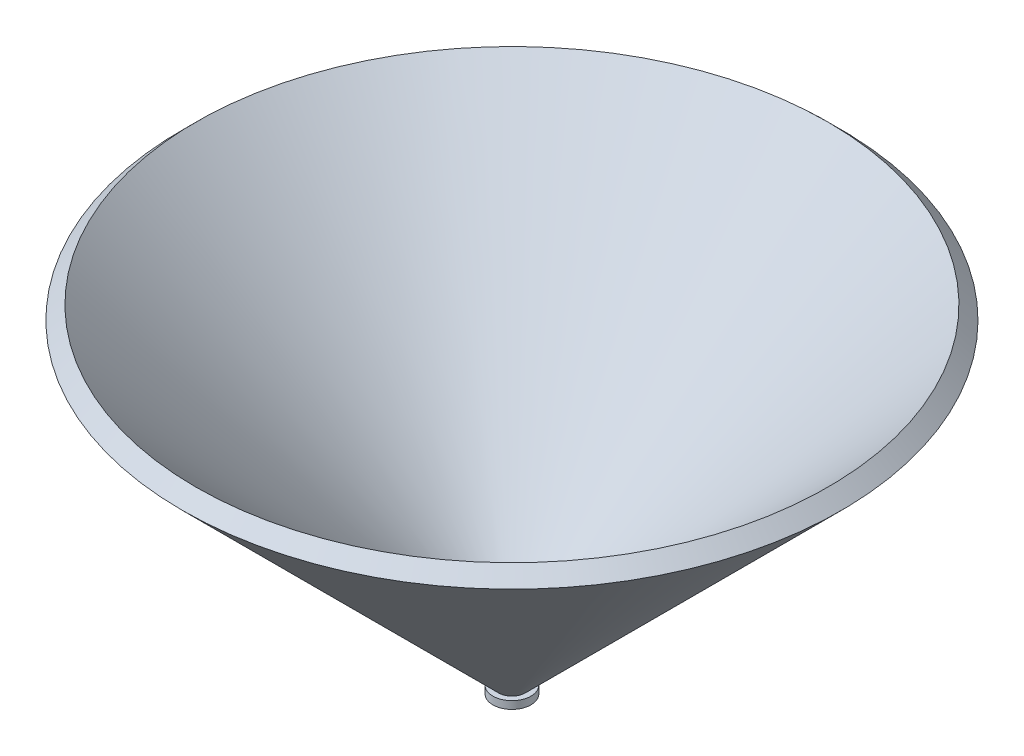
ISO-10303-21;
HEADER;
FILE_DESCRIPTION(('STEP AP214'),'2;1');
FILE_NAME('part.step','',(''),(''),'','','');
FILE_SCHEMA(('AUTOMOTIVE_DESIGN { 1 0 10303 214 1 1 1 1 }'));
ENDSEC;
DATA;
#1=APPLICATION_CONTEXT('core data for automotive mechanical design processes');
#2=APPLICATION_PROTOCOL_DEFINITION('international standard','automotive_design',2000,#1);
#3=PRODUCT_CONTEXT('',#1,'mechanical');
#4=PRODUCT('Part','Part','',(#3));
#5=PRODUCT_RELATED_PRODUCT_CATEGORY('part','',(#4));
#6=PRODUCT_DEFINITION_FORMATION('','',#4);
#7=PRODUCT_DEFINITION_CONTEXT('part definition',#1,'design');
#8=PRODUCT_DEFINITION('design','',#6,#7);
#9=PRODUCT_DEFINITION_SHAPE('','',#8);
#10=(LENGTH_UNIT() NAMED_UNIT(*) SI_UNIT(.MILLI.,.METRE.));
#11=(NAMED_UNIT(*) PLANE_ANGLE_UNIT() SI_UNIT($,.RADIAN.));
#12=(NAMED_UNIT(*) SI_UNIT($,.STERADIAN.) SOLID_ANGLE_UNIT());
#13=UNCERTAINTY_MEASURE_WITH_UNIT(LENGTH_MEASURE(1.E-05),#10,'distance_accuracy_value','');
#14=(GEOMETRIC_REPRESENTATION_CONTEXT(3) GLOBAL_UNCERTAINTY_ASSIGNED_CONTEXT((#13)) GLOBAL_UNIT_ASSIGNED_CONTEXT((#10,
#11,#12)) REPRESENTATION_CONTEXT('',''));
#15=CARTESIAN_POINT('',(0.,0.,0.));
#16=DIRECTION('',(0.,0.,1.));
#17=DIRECTION('',(1.,0.,0.));
#18=AXIS2_PLACEMENT_3D('',#15,#16,#17);
#19=CARTESIAN_POINT('',(3.175,7.03012806053454,0.));
#20=DIRECTION('',(0.,-0.707106781186551,-0.707106781186544));
#21=DIRECTION('',(0.,0.707106781186544,-0.707106781186551));
#22=AXIS2_PLACEMENT_3D('',#19,#20,#21);
#23=PLANE('',#22);
#24=CARTESIAN_POINT('',(3.1752,112.52425081414,-105.494122753607));
#25=CARTESIAN_POINT('',(2.1168,112.540175260111,-105.510047199578));
#26=CARTESIAN_POINT('',(1.0584,112.548137483097,-105.518009422563));
#27=CARTESIAN_POINT('',(-1.0584,112.548137483097,-105.518009422563));
#28=CARTESIAN_POINT('',(-2.1168,112.540175260111,-105.510047199578));
#29=CARTESIAN_POINT('',(-3.1752,112.52425081414,-105.494122753607));
#30=B_SPLINE_CURVE_WITH_KNOTS('',3,(#24,#25,#26,#27,#28,#29),.UNSPECIFIED.,.F.,.F.,(4,2,4),(0.,
3.1753796916129,6.3507593832258),.UNSPECIFIED.);
#31=CARTESIAN_POINT('',(3.175,112.5242538232,-105.494125762667));
#32=VERTEX_POINT('',#31);
#33=CARTESIAN_POINT('',(0.,112.548137483097,-105.518009422563));
#34=VERTEX_POINT('',#33);
#35=EDGE_CURVE('E131',#32,#34,#30,.T.);
#36=ORIENTED_EDGE('',*,*,#35,.F.);
#37=DIRECTION('',(0.,-0.707106781186544,0.707106781186551));
#38=VECTOR('',#37,1.);
#39=CARTESIAN_POINT('',(3.175,7.03012806053454,0.));
#40=LINE('',#39,#38);
#41=CARTESIAN_POINT('',(3.175,112.548137483097,-105.518009422563));
#42=VERTEX_POINT('',#41);
#43=EDGE_CURVE('E175',#42,#32,#40,.T.);
#44=ORIENTED_EDGE('',*,*,#43,.F.);
#45=DIRECTION('',(-1.,0.,0.));
#46=VECTOR('',#45,1.);
#47=CARTESIAN_POINT('',(3.175,112.548137483097,-105.518009422563));
#48=LINE('',#47,#46);
#49=EDGE_CURVE('E158',#42,#34,#48,.T.);
#50=ORIENTED_EDGE('',*,*,#49,.T.);
#51=EDGE_LOOP('',(#36,#44,#50));
#52=FACE_BOUND('',#51,.T.);
#53=ADVANCED_FACE('F34',(#52),#23,.F.);
#54=CARTESIAN_POINT('',(-3.175,112.5242538232,-105.494125762667));
#55=VERTEX_POINT('',#54);
#56=EDGE_CURVE('E54',#34,#55,#30,.T.);
#57=ORIENTED_EDGE('',*,*,#56,.F.);
#58=CARTESIAN_POINT('',(-3.175,112.548137483097,-105.518009422563));
#59=VERTEX_POINT('',#58);
#60=EDGE_CURVE('E161',#34,#59,#48,.T.);
#61=ORIENTED_EDGE('',*,*,#60,.T.);
#62=DIRECTION('',(0.,-0.707106781186544,0.707106781186551));
#63=VECTOR('',#62,1.);
#64=CARTESIAN_POINT('',(-3.175,7.03012806053454,0.));
#65=LINE('',#64,#63);
#66=EDGE_CURVE('E162',#59,#55,#65,.T.);
#67=ORIENTED_EDGE('',*,*,#66,.T.);
#68=EDGE_LOOP('',(#57,#61,#67));
#69=FACE_BOUND('',#68,.T.);
#70=ADVANCED_FACE('F111',(#69),#23,.F.);
#71=CARTESIAN_POINT('',(3.175,0.,0.));
#72=DIRECTION('',(1.,0.,0.));
#73=DIRECTION('',(0.,0.,-1.));
#74=AXIS2_PLACEMENT_3D('',#71,#72,#73);
#75=PLANE('',#74);
#76=CARTESIAN_POINT('',(3.175,200.440526691439,-17.3372968751184));
#77=CARTESIAN_POINT('',(3.175,199.837144502714,-17.950682651951));
#78=CARTESIAN_POINT('',(3.175,199.233266251423,-18.5635798615694));
#79=CARTESIAN_POINT('',(3.175,198.024720068944,-19.7885945605061));
#80=CARTESIAN_POINT('',(3.175,197.420052138242,-20.4007120503028));
#81=CARTESIAN_POINT('',(3.175,196.21012933855,-21.624364426881));
#82=CARTESIAN_POINT('',(3.175,195.604874470568,-22.2358993146598));
#83=CARTESIAN_POINT('',(3.175,194.393900872155,-23.4585098213873));
#84=CARTESIAN_POINT('',(3.175,193.78818214164,-24.0695854402542));
#85=CARTESIAN_POINT('',(3.175,191.970483506003,-25.902268203571));
#86=CARTESIAN_POINT('',(3.175,190.757958133462,-27.1233343102523));
#87=CARTESIAN_POINT('',(3.175,188.331945039224,-29.5645112103778));
#88=CARTESIAN_POINT('',(3.175,187.118457316989,-30.7846220032862));
#89=CARTESIAN_POINT('',(3.175,183.477021622506,-34.4439528778655));
#90=CARTESIAN_POINT('',(3.175,181.048084317772,-36.8821883792525));
#91=CARTESIAN_POINT('',(3.175,176.188803794932,-41.7572580859253));
#92=CARTESIAN_POINT('',(3.175,173.758460576648,-44.1940922910332));
#93=CARTESIAN_POINT('',(3.175,168.896910624069,-49.0668993440678));
#94=CARTESIAN_POINT('',(3.175,166.46570388974,-51.5028721919628));
#95=CARTESIAN_POINT('',(3.175,161.602730189482,-56.374258286182));
#96=CARTESIAN_POINT('',(3.175,159.170963223583,-58.8096715325387));
#97=CARTESIAN_POINT('',(3.175,151.875085175611,-66.1153586832649));
#98=CARTESIAN_POINT('',(3.175,147.010408840598,-70.9850680785807));
#99=CARTESIAN_POINT('',(3.175,137.280275073362,-80.7237055511025));
#100=CARTESIAN_POINT('',(3.175,132.414817641205,-85.5926336283736));
#101=CARTESIAN_POINT('',(3.175,125.629817888244,-92.381809655797));
#102=CARTESIAN_POINT('',(3.175,123.710476484159,-94.3022584000018));
#103=CARTESIAN_POINT('',(3.175,119.871732108325,-98.1430918108623));
#104=CARTESIAN_POINT('',(3.175,117.952329136617,-100.06347647756));
#105=CARTESIAN_POINT('',(3.175,108.99069279537,-109.029457707226));
#106=CARTESIAN_POINT('',(3.175,101.948141007366,-116.074736005152));
#107=CARTESIAN_POINT('',(3.175,87.862649269537,-130.164904596144));
#108=CARTESIAN_POINT('',(3.175,80.8197093197109,-137.209794889208));
#109=CARTESIAN_POINT('',(3.175,66.733564348039,-151.299352916492));
#110=CARTESIAN_POINT('',(3.175,59.6903593254583,-158.344020649977));
#111=CARTESIAN_POINT('',(3.175,45.6037807524923,-172.433187551712));
#112=CARTESIAN_POINT('',(3.175,38.5604072021078,-179.477686719963));
#113=CARTESIAN_POINT('',(3.175,31.5169870136748,-186.522139252704));
#114=B_SPLINE_CURVE_WITH_KNOTS('',3,(#76,#77,#78,#79,#80,#81,#82,#83,#84,#85,#86,#87,#88,#89,
#90,#91,#92,#93,#94,#95,#96,#97,#98,#99,#100,#101,#102,#103,#104,#105,#106,#107,#108,#109,#110,
#111,#112,#113),.UNSPECIFIED.,.F.,.F.,(4,2,2,2,2,2,2,2,2,2,2,2,2,2,2,2,2,2,4),(0.,
2.58124098013675,5.16248037591217,7.74371534458528,10.3249507727548,15.4874087337547,
20.6498695882519,30.9747197477381,41.2995712165369,51.624423064826,61.9492743126231,
82.5990273339478,103.248778631242,111.39420392482,119.539623822162,149.424424905081,
179.309226076388,209.1941173086,239.079008394447),.UNSPECIFIED.);
#115=CARTESIAN_POINT('',(3.175,108.058009422562,-109.962310304486));
#116=VERTEX_POINT('',#115);
#117=EDGE_CURVE('E62',#32,#116,#114,.T.);
#118=ORIENTED_EDGE('',*,*,#117,.T.);
#119=CARTESIAN_POINT('',(3.175,199.518051019844,-201.443159618202));
#120=CARTESIAN_POINT('',(3.175,192.561915516085,-194.486153222348));
#121=CARTESIAN_POINT('',(3.175,185.605818214246,-187.529108627867));
#122=CARTESIAN_POINT('',(3.175,171.693749100649,-173.614893053145));
#123=CARTESIAN_POINT('',(3.175,164.7377772889,-166.657722072896));
#124=CARTESIAN_POINT('',(3.175,150.825998671121,-152.74319416555));
#125=CARTESIAN_POINT('',(3.175,143.870191865357,-145.785837238188));
#126=CARTESIAN_POINT('',(3.175,129.958847254739,-131.870855343057));
#127=CARTESIAN_POINT('',(3.175,123.003309449869,-124.913230375305));
#128=CARTESIAN_POINT('',(3.175,109.097339589966,-111.002230618048));
#129=CARTESIAN_POINT('',(3.175,102.146907246755,-104.048856116628));
#130=CARTESIAN_POINT('',(3.175,91.7218401021594,-93.6182119215384));
#131=CARTESIAN_POINT('',(3.175,88.246914271722,-90.1412331051456));
#132=CARTESIAN_POINT('',(3.175,81.2973402190702,-83.1869981827456));
#133=CARTESIAN_POINT('',(3.175,77.8226919968505,-79.7097420767438));
#134=CARTESIAN_POINT('',(3.175,70.8738022630794,-72.754829961619));
#135=CARTESIAN_POINT('',(3.175,67.3995607511521,-69.2771739528718));
#136=CARTESIAN_POINT('',(3.175,60.451705357375,-62.3212345094503));
#137=CARTESIAN_POINT('',(3.175,56.9780914755723,-58.8429510747291));
#138=CARTESIAN_POINT('',(3.175,50.0318921825025,-51.8853596136983));
#139=CARTESIAN_POINT('',(3.175,46.5593067708796,-48.406051587744));
#140=CARTESIAN_POINT('',(3.175,41.351890458129,-43.1856317373281));
#141=CARTESIAN_POINT('',(3.175,39.6163287600139,-41.4452489243445));
#142=CARTESIAN_POINT('',(3.175,36.1459208087547,-37.9637701653254));
#143=CARTESIAN_POINT('',(3.175,34.4110745555792,-36.2226742193212));
#144=CARTESIAN_POINT('',(3.175,31.7256979913831,-33.5259333310758));
#145=CARTESIAN_POINT('',(3.175,30.7747858741409,-32.5706686033746));
#146=CARTESIAN_POINT('',(3.175,28.8733916546759,-30.6597111151943));
#147=CARTESIAN_POINT('',(3.175,27.9229095524868,-29.7040183546817));
#148=CARTESIAN_POINT('',(3.175,26.0224296574051,-27.7919849779321));
#149=CARTESIAN_POINT('',(3.175,25.0724319141878,-26.8356443123093));
#150=CARTESIAN_POINT('',(3.175,23.173218723277,-24.9221868987253));
#151=CARTESIAN_POINT('',(3.175,22.2240032754545,-23.9650701508922));
#152=CARTESIAN_POINT('',(3.175,20.0059461796568,-21.7260195860442));
#153=CARTESIAN_POINT('',(3.175,18.7375322430043,-20.4436616517314));
#154=CARTESIAN_POINT('',(3.175,16.8375422667745,-18.5177396996414));
#155=CARTESIAN_POINT('',(3.175,16.2047033276086,-17.8754217696252));
#156=CARTESIAN_POINT('',(3.175,14.9401940915483,-16.5896371547109));
#157=CARTESIAN_POINT('',(3.175,14.3085237935301,-15.9461704709185));
#158=CARTESIAN_POINT('',(3.175,13.2556970067994,-14.8709147242164));
#159=CARTESIAN_POINT('',(3.175,12.8340819323047,-14.4395747594874));
#160=CARTESIAN_POINT('',(3.175,11.9918200191652,-13.5759505364723));
#161=CARTESIAN_POINT('',(3.175,11.5711731800159,-13.1436662786786));
#162=CARTESIAN_POINT('',(3.175,10.7309541564058,-12.2776318570922));
#163=CARTESIAN_POINT('',(3.175,10.3113826189845,-11.8438810652788));
#164=CARTESIAN_POINT('',(3.175,9.4740001667022,-10.9746857262887));
#165=CARTESIAN_POINT('',(3.175,9.05618924225662,-10.5392411883575));
#166=CARTESIAN_POINT('',(3.175,8.36073206055526,-9.81024210093843));
#167=CARTESIAN_POINT('',(3.175,8.08239227441539,-9.5173494388155));
#168=CARTESIAN_POINT('',(3.175,7.52718425763152,-8.9301726211461));
#169=CARTESIAN_POINT('',(3.175,7.25031602327546,-8.63588846911325));
#170=CARTESIAN_POINT('',(3.175,6.69894628675608,-8.04592223083668));
#171=CARTESIAN_POINT('',(3.175,6.42444189598318,-7.75024284685787));
#172=CARTESIAN_POINT('',(3.175,5.87811867366579,-7.15642575182525));
#173=CARTESIAN_POINT('',(3.175,5.60629974823107,-6.85828812739072));
#174=CARTESIAN_POINT('',(3.175,5.15581921401611,-6.3577875308385));
#175=CARTESIAN_POINT('',(3.175,4.9760970500796,-6.15638010438162));
#176=CARTESIAN_POINT('',(3.175,4.61890555681003,-5.75157976014491));
#177=CARTESIAN_POINT('',(3.175,4.4414361895919,-5.54818687585636));
#178=CARTESIAN_POINT('',(3.175,4.08866560745706,-5.13784599083981));
#179=CARTESIAN_POINT('',(3.175,3.91337860161195,-4.93088573202484));
#180=CARTESIAN_POINT('',(3.175,3.56703726573556,-4.51354092637145));
#181=CARTESIAN_POINT('',(3.175,3.39598177712001,-4.30315734358356));
#182=CARTESIAN_POINT('',(3.175,3.05822469498269,-3.87562003173794));
#183=CARTESIAN_POINT('',(3.175,2.89157980217528,-3.65842100957378));
#184=CARTESIAN_POINT('',(3.175,2.6484123857098,-3.3273863440383));
#185=CARTESIAN_POINT('',(3.175,2.5684369674218,-3.21609000805243));
#186=CARTESIAN_POINT('',(3.175,2.41140728377533,-2.9914604443459));
#187=CARTESIAN_POINT('',(3.175,2.33435277005435,-2.87812739101933));
#188=CARTESIAN_POINT('',(3.175,2.18442386255193,-2.64976667702616));
#189=CARTESIAN_POINT('',(3.175,2.11152562807547,-2.53475474544742));
#190=CARTESIAN_POINT('',(3.175,1.97039885416144,-2.30184604310898));
#191=CARTESIAN_POINT('',(3.175,1.90217131942869,-2.18394865902323));
#192=CARTESIAN_POINT('',(3.175,1.77196527087485,-1.94508573029549));
#193=CARTESIAN_POINT('',(3.175,1.70997237849318,-1.82412808980253));
#194=CARTESIAN_POINT('',(3.175,1.59395494763549,-1.57848254825579));
#195=CARTESIAN_POINT('',(3.175,1.539925302508,-1.45379710002094));
#196=CARTESIAN_POINT('',(3.175,1.45415284455452,-1.23137858038987));
#197=CARTESIAN_POINT('',(3.175,1.42019044698216,-1.13450641547978));
#198=CARTESIAN_POINT('',(3.175,1.35936982812462,-0.938522067202194));
#199=CARTESIAN_POINT('',(3.175,1.33251186299046,-0.839409803207509));
#200=CARTESIAN_POINT('',(3.175,1.28722034694143,-0.639694010518449));
#201=CARTESIAN_POINT('',(3.175,1.26875145180506,-0.539098617199734));
#202=CARTESIAN_POINT('',(3.175,1.24109382943329,-0.336629645531783));
#203=CARTESIAN_POINT('',(3.175,1.23190402488381,-0.234756216954794));
#204=CARTESIAN_POINT('',(3.175,1.22334977604248,-0.0298319077772163));
#205=CARTESIAN_POINT('',(3.175,1.22405869402776,0.0732221023369381));
#206=CARTESIAN_POINT('',(3.175,1.23543359011541,0.27877190071514));
#207=CARTESIAN_POINT('',(3.175,1.24609999885696,0.381267664643456));
#208=CARTESIAN_POINT('',(3.175,1.27676581906478,0.585166818681777));
#209=CARTESIAN_POINT('',(3.175,1.2967949644916,0.686565667869983));
#210=CARTESIAN_POINT('',(3.175,1.34509873773803,0.887354378938889));
#211=CARTESIAN_POINT('',(3.175,1.37337461562819,0.986743933799036));
#212=CARTESIAN_POINT('',(3.175,1.4669572665408,1.27617632620627));
#213=CARTESIAN_POINT('',(3.175,1.54200015719976,1.46308763934443));
#214=CARTESIAN_POINT('',(3.175,1.66808116393195,1.73706350555952));
#215=CARTESIAN_POINT('',(3.175,1.71241197473352,1.82741060220863));
#216=CARTESIAN_POINT('',(3.175,1.80480556834212,2.00617982433032));
#217=CARTESIAN_POINT('',(3.175,1.85286781723342,2.09460222289013));
#218=CARTESIAN_POINT('',(3.175,1.95242463160319,2.2703696059677));
#219=CARTESIAN_POINT('',(3.175,2.00394261430494,2.35770119813327));
#220=CARTESIAN_POINT('',(3.175,2.1095372542723,2.53080210169499));
#221=CARTESIAN_POINT('',(3.175,2.16361396005009,2.61657138342772));
#222=CARTESIAN_POINT('',(3.175,2.2738396055859,2.78665939275662));
#223=CARTESIAN_POINT('',(3.175,2.32998673885356,2.8709792949846));
#224=CARTESIAN_POINT('',(3.175,2.44404913481176,3.03840659646553));
#225=CARTESIAN_POINT('',(3.175,2.50196433324265,3.12151403962297));
#226=CARTESIAN_POINT('',(3.175,2.68766395951254,3.38295858466804));
#227=CARTESIAN_POINT('',(3.175,2.81818328485172,3.55935382003774));
#228=CARTESIAN_POINT('',(3.175,3.08412128810594,3.90842336972371));
#229=CARTESIAN_POINT('',(3.175,3.21954079273206,4.0810970482599));
#230=CARTESIAN_POINT('',(3.175,3.49402883999405,4.42365439594157));
#231=CARTESIAN_POINT('',(3.175,3.63309918755053,4.59353661488817));
#232=CARTESIAN_POINT('',(3.175,3.91393601982971,4.93106199919123));
#233=CARTESIAN_POINT('',(3.175,4.05570261333783,5.09870507373843));
#234=CARTESIAN_POINT('',(3.175,4.34156821621994,5.43251846008849));
#235=CARTESIAN_POINT('',(3.175,4.48567101210672,5.59868552341658));
#236=CARTESIAN_POINT('',(3.175,4.7755146346165,5.92958622072276));
#237=CARTESIAN_POINT('',(3.175,4.92125548243493,6.09431983610383));
#238=CARTESIAN_POINT('',(3.175,5.36032918177927,6.58668001945057));
#239=CARTESIAN_POINT('',(3.175,5.65560542612674,6.912572704585));
#240=CARTESIAN_POINT('',(3.175,6.24881649346346,7.56034506558426));
#241=CARTESIAN_POINT('',(3.175,6.54674230255297,7.88223303026376));
#242=CARTESIAN_POINT('',(3.175,7.1450346245761,8.52377583152646));
#243=CARTESIAN_POINT('',(3.175,7.44540132011936,8.84343049764056));
#244=CARTESIAN_POINT('',(3.175,8.04755416076277,9.48071085453775));
#245=CARTESIAN_POINT('',(3.175,8.34933830545515,9.79833843790413));
#246=CARTESIAN_POINT('',(3.175,8.95422565902703,10.4323186503989));
#247=CARTESIAN_POINT('',(3.175,9.25732883388901,10.7486713120067));
#248=CARTESIAN_POINT('',(3.175,10.1650682926525,11.693060784695));
#249=CARTESIAN_POINT('',(3.175,10.7712001507442,12.319659528954));
#250=CARTESIAN_POINT('',(3.175,11.9859754420461,13.5704189873456));
#251=CARTESIAN_POINT('',(3.175,12.5946188870458,14.194579690007));
#252=CARTESIAN_POINT('',(3.175,13.8136203047462,15.4412497758576));
#253=CARTESIAN_POINT('',(3.175,14.423978313381,16.0637591238977));
#254=CARTESIAN_POINT('',(3.175,15.6458974140864,17.3075962247692));
#255=CARTESIAN_POINT('',(3.175,16.2574585070705,17.9289239767028));
#256=CARTESIAN_POINT('',(3.175,18.093999675358,19.7921927522914));
#257=CARTESIAN_POINT('',(3.175,19.3202807661372,21.032851154167));
#258=CARTESIAN_POINT('',(3.175,21.7748230550215,23.5121813000579));
#259=CARTESIAN_POINT('',(3.175,23.0030842331999,24.7508530638185));
#260=CARTESIAN_POINT('',(3.175,25.4605291072606,27.2265682361226));
#261=CARTESIAN_POINT('',(3.175,26.6897124324959,28.4636120126166));
#262=CARTESIAN_POINT('',(3.175,29.1489407477933,30.936849134717));
#263=CARTESIAN_POINT('',(3.175,30.3789857401445,32.1730424780467));
#264=CARTESIAN_POINT('',(3.175,32.8395030743514,34.644645462579));
#265=CARTESIAN_POINT('',(3.175,34.0699753279275,35.8800551916721));
#266=CARTESIAN_POINT('',(3.175,36.5313630765362,38.3504310444231));
#267=CARTESIAN_POINT('',(3.175,37.7622785712189,39.5853971684298));
#268=CARTESIAN_POINT('',(3.175,41.0984885946176,42.9316875343497));
#269=CARTESIAN_POINT('',(3.175,43.2041019541392,45.0426938957833));
#270=CARTESIAN_POINT('',(3.175,47.4159577501041,49.2640800057602));
#271=CARTESIAN_POINT('',(3.175,49.5222001867147,51.3744597541367));
#272=CARTESIAN_POINT('',(3.175,55.8418021110594,57.7052006273632));
#273=CARTESIAN_POINT('',(3.175,60.0557989464146,61.9249255037146));
#274=CARTESIAN_POINT('',(3.175,68.4854856886247,70.3643001248188));
#275=CARTESIAN_POINT('',(3.175,72.7011757651847,74.583949700036));
#276=CARTESIAN_POINT('',(3.175,79.024996400398,80.9128993491409));
#277=CARTESIAN_POINT('',(3.175,81.1329243357918,83.0224018836051));
#278=CARTESIAN_POINT('',(3.175,85.3488896530812,87.2412974622913));
#279=CARTESIAN_POINT('',(3.175,87.4569270349737,89.3506905065166));
#280=CARTESIAN_POINT('',(3.175,89.5650063926064,91.4600415972825));
#281=B_SPLINE_CURVE_WITH_KNOTS('',3,(#119,#120,#121,#122,#123,#124,#125,#126,#127,#128,#129,
#130,#131,#132,#133,#134,#135,#136,#137,#138,#139,#140,#141,#142,#143,#144,#145,#146,#147,#148,
#149,#150,#151,#152,#153,#154,#155,#156,#157,#158,#159,#160,#161,#162,#163,#164,#165,#166,#167,
#168,#169,#170,#171,#172,#173,#174,#175,#176,#177,#178,#179,#180,#181,#182,#183,#184,#185,#186,
#187,#188,#189,#190,#191,#192,#193,#194,#195,#196,#197,#198,#199,#200,#201,#202,#203,#204,#205,
#206,#207,#208,#209,#210,#211,#212,#213,#214,#215,#216,#217,#218,#219,#220,#221,#222,#223,#224,
#225,#226,#227,#228,#229,#230,#231,#232,#233,#234,#235,#236,#237,#238,#239,#240,#241,#242,#243,
#244,#245,#246,#247,#248,#249,#250,#251,#252,#253,#254,#255,#256,#257,#258,#259,#260,#261,#262,
#263,#264,#265,#266,#267,#268,#269,#270,#271,#272,#273,#274,#275,#276,#277,#278,#279,#280),
.UNSPECIFIED.,.F.,.F.,(4,2,2,2,2,2,2,2,2,2,2,2,2,2,2,2,2,2,2,2,2,2,2,2,2,2,2,2,2,2,2,2,2,2,2,2,
2,2,2,2,2,2,2,2,2,2,2,2,2,2,2,2,2,2,2,2,2,2,2,2,2,2,2,2,2,2,2,2,2,2,2,2,2,2,2,2,2,2,2,2,4),(0.,
29.5142310136656,59.0284639692005,88.5427414173059,118.057016974626,147.551445906579,
162.298663292109,177.045880389676,191.793083744175,206.540288203352,221.287487553915,
228.661086333615,236.034684788009,240.078306943936,244.121929416774,248.165905837899,
252.209881592304,257.620962175069,260.3260521885,263.031139599379,264.840646991079,
266.650153439669,268.460570143327,270.270976978459,271.483133526567,272.695287015495,
273.905652545925,275.115975608283,275.925768732254,276.73554821992,277.549154428959,
278.362535351182,279.18363279419,279.594750355186,280.005832880368,280.414253003246,
280.822760706278,281.230303581828,281.637583961421,281.94531979289,282.253066718294,
282.559504758667,282.865907217105,283.174581709902,283.483269552797,283.792944449652,
284.102666312604,284.705207586635,285.007081558561,285.308912415939,285.613049227373,
285.917191807411,286.22107502014,286.524947201468,287.18310482988,287.841374018813,
288.499975013679,289.158602637726,289.818432992169,290.47827189428,291.797526450091,
293.113317808179,294.429208527594,295.743604212937,297.057966198839,299.673329877735,
302.28870584728,304.90413704541,307.519570229889,312.752823226444,317.986023882425,
323.217707486203,328.449405041385,333.680340985427,338.911272807682,347.856081082634,
356.80089173722,374.691520978677,392.585580515092,401.532102187365,410.478623604568),.UNSPECIFIED.);
#282=CARTESIAN_POINT('',(3.175,2.54,-3.17500000000007));
#283=VERTEX_POINT('',#282);
#284=EDGE_CURVE('E186',#116,#283,#281,.T.);
#285=ORIENTED_EDGE('',*,*,#284,.T.);
#286=DIRECTION('',(0.,0.,-1.));
#287=VECTOR('',#286,1.);
#288=CARTESIAN_POINT('',(3.175,2.54,0.));
#289=LINE('',#288,#287);
#290=CARTESIAN_POINT('',(3.175,2.54,-4.49012806053463));
#291=VERTEX_POINT('',#290);
#292=EDGE_CURVE('E164',#283,#291,#289,.T.);
#293=ORIENTED_EDGE('',*,*,#292,.T.);
#294=DIRECTION('',(0.,0.707106781186544,-0.707106781186551));
#295=VECTOR('',#294,1.);
#296=CARTESIAN_POINT('',(3.175,108.058009422562,-110.008137483098));
#297=LINE('',#296,#295);
#298=CARTESIAN_POINT('',(3.175,108.058009422562,-110.008137483098));
#299=VERTEX_POINT('',#298);
#300=EDGE_CURVE('E179',#291,#299,#297,.T.);
#301=ORIENTED_EDGE('',*,*,#300,.T.);
#302=DIRECTION('',(0.,0.707106781186551,0.707106781186544));
#303=VECTOR('',#302,1.);
#304=CARTESIAN_POINT('',(3.175,112.548137483097,-105.518009422563));
#305=LINE('',#304,#303);
#306=EDGE_CURVE('E177',#299,#42,#305,.T.);
#307=ORIENTED_EDGE('',*,*,#306,.T.);
#308=ORIENTED_EDGE('',*,*,#43,.T.);
#309=EDGE_LOOP('',(#118,#285,#293,#301,#307,#308));
#310=FACE_BOUND('',#309,.T.);
#311=ADVANCED_FACE('F117',(#310),#75,.T.);
#312=CARTESIAN_POINT('',(-3.175,0.,0.));
#313=DIRECTION('',(1.,0.,0.));
#314=DIRECTION('',(0.,0.,-1.));
#315=AXIS2_PLACEMENT_3D('',#312,#313,#314);
#316=PLANE('',#315);
#317=CARTESIAN_POINT('',(-3.175,199.518051019844,-201.443159618202));
#318=CARTESIAN_POINT('',(-3.175,192.561915516085,-194.486153222348));
#319=CARTESIAN_POINT('',(-3.175,185.605818214246,-187.529108627867));
#320=CARTESIAN_POINT('',(-3.175,171.693749100649,-173.614893053145));
#321=CARTESIAN_POINT('',(-3.175,164.7377772889,-166.657722072896));
#322=CARTESIAN_POINT('',(-3.175,150.825998671121,-152.74319416555));
#323=CARTESIAN_POINT('',(-3.175,143.870191865357,-145.785837238188));
#324=CARTESIAN_POINT('',(-3.175,129.958847254739,-131.870855343057));
#325=CARTESIAN_POINT('',(-3.175,123.003309449868,-124.913230375305));
#326=CARTESIAN_POINT('',(-3.175,109.097339589966,-111.002230618048));
#327=CARTESIAN_POINT('',(-3.175,102.146907246755,-104.048856116627));
#328=CARTESIAN_POINT('',(-3.175,91.7218401021592,-93.6182119215381));
#329=CARTESIAN_POINT('',(-3.175,88.2469142717218,-90.1412331051453));
#330=CARTESIAN_POINT('',(-3.175,81.29734021907,-83.1869981827454));
#331=CARTESIAN_POINT('',(-3.175,77.8226919968503,-79.7097420767436));
#332=CARTESIAN_POINT('',(-3.175,70.8738022630792,-72.7548299616188));
#333=CARTESIAN_POINT('',(-3.175,67.3995607511519,-69.2771739528716));
#334=CARTESIAN_POINT('',(-3.175,60.4517053573749,-62.3212345094502));
#335=CARTESIAN_POINT('',(-3.175,56.9780914755722,-58.842951074729));
#336=CARTESIAN_POINT('',(-3.175,50.0318921825024,-51.8853596136982));
#337=CARTESIAN_POINT('',(-3.175,46.5593067708795,-48.406051587744));
#338=CARTESIAN_POINT('',(-3.175,41.351890458129,-43.1856317373281));
#339=CARTESIAN_POINT('',(-3.175,39.6163287600138,-41.4452489243445));
#340=CARTESIAN_POINT('',(-3.175,36.1459208087547,-37.9637701653253));
#341=CARTESIAN_POINT('',(-3.175,34.4110745555792,-36.2226742193212));
#342=CARTESIAN_POINT('',(-3.175,31.7256979913831,-33.5259333310758));
#343=CARTESIAN_POINT('',(-3.175,30.7747858741409,-32.5706686033746));
#344=CARTESIAN_POINT('',(-3.175,28.8733916546759,-30.6597111151943));
#345=CARTESIAN_POINT('',(-3.175,27.9229095524868,-29.7040183546817));
#346=CARTESIAN_POINT('',(-3.175,26.0224296574051,-27.7919849779321));
#347=CARTESIAN_POINT('',(-3.175,25.0724319141878,-26.8356443123092));
#348=CARTESIAN_POINT('',(-3.175,23.173218723277,-24.9221868987253));
#349=CARTESIAN_POINT('',(-3.175,22.2240032754545,-23.9650701508921));
#350=CARTESIAN_POINT('',(-3.175,20.0059461796568,-21.7260195860442));
#351=CARTESIAN_POINT('',(-3.175,18.7375322430043,-20.4436616517314));
#352=CARTESIAN_POINT('',(-3.175,16.8375422667745,-18.5177396996413));
#353=CARTESIAN_POINT('',(-3.175,16.2047033276086,-17.8754217696252));
#354=CARTESIAN_POINT('',(-3.175,14.9401940915483,-16.5896371547109));
#355=CARTESIAN_POINT('',(-3.175,14.3085237935301,-15.9461704709184));
#356=CARTESIAN_POINT('',(-3.175,13.2556970067994,-14.8709147242164));
#357=CARTESIAN_POINT('',(-3.175,12.8340819323047,-14.4395747594874));
#358=CARTESIAN_POINT('',(-3.175,11.9918200191653,-13.5759505364723));
#359=CARTESIAN_POINT('',(-3.175,11.5711731800159,-13.1436662786787));
#360=CARTESIAN_POINT('',(-3.175,10.7309541564058,-12.2776318570922));
#361=CARTESIAN_POINT('',(-3.175,10.3113826189845,-11.8438810652788));
#362=CARTESIAN_POINT('',(-3.175,9.4740001667022,-10.9746857262887));
#363=CARTESIAN_POINT('',(-3.175,9.05618924225661,-10.5392411883575));
#364=CARTESIAN_POINT('',(-3.175,8.36073206055525,-9.81024210093842));
#365=CARTESIAN_POINT('',(-3.175,8.08239227441538,-9.51734943881549));
#366=CARTESIAN_POINT('',(-3.175,7.52718425763151,-8.93017262114609));
#367=CARTESIAN_POINT('',(-3.175,7.25031602327545,-8.63588846911325));
#368=CARTESIAN_POINT('',(-3.175,6.69894628675608,-8.04592223083668));
#369=CARTESIAN_POINT('',(-3.175,6.4244418959832,-7.75024284685789));
#370=CARTESIAN_POINT('',(-3.175,5.87811867366581,-7.15642575182527));
#371=CARTESIAN_POINT('',(-3.175,5.60629974823108,-6.85828812739073));
#372=CARTESIAN_POINT('',(-3.175,5.1558192140161,-6.35778753083848));
#373=CARTESIAN_POINT('',(-3.175,4.97609705007957,-6.15638010438159));
#374=CARTESIAN_POINT('',(-3.175,4.61890555680999,-5.75157976014486));
#375=CARTESIAN_POINT('',(-3.175,4.44143618959186,-5.54818687585631));
#376=CARTESIAN_POINT('',(-3.175,4.08866560745702,-5.13784599083976));
#377=CARTESIAN_POINT('',(-3.175,3.91337860161191,-4.93088573202479));
#378=CARTESIAN_POINT('',(-3.175,3.56703726573554,-4.51354092637142));
#379=CARTESIAN_POINT('',(-3.175,3.39598177711999,-4.30315734358354));
#380=CARTESIAN_POINT('',(-3.175,3.05822469498268,-3.87562003173793));
#381=CARTESIAN_POINT('',(-3.175,2.89157980217527,-3.65842100957376));
#382=CARTESIAN_POINT('',(-3.175,2.64841238570978,-3.32738634403827));
#383=CARTESIAN_POINT('',(-3.175,2.56843696742178,-3.21609000805239));
#384=CARTESIAN_POINT('',(-3.175,2.4114072837753,-2.99146044434586));
#385=CARTESIAN_POINT('',(-3.175,2.33435277005432,-2.87812739101928));
#386=CARTESIAN_POINT('',(-3.175,2.18442386255191,-2.64976667702613));
#387=CARTESIAN_POINT('',(-3.175,2.11152562807546,-2.53475474544741));
#388=CARTESIAN_POINT('',(-3.175,1.97039885416143,-2.30184604310896));
#389=CARTESIAN_POINT('',(-3.175,1.90217131942867,-2.1839486590232));
#390=CARTESIAN_POINT('',(-3.175,1.77196527087483,-1.94508573029545));
#391=CARTESIAN_POINT('',(-3.175,1.70997237849317,-1.82412808980251));
#392=CARTESIAN_POINT('',(-3.175,1.59395494763549,-1.57848254825579));
#393=CARTESIAN_POINT('',(-3.175,1.539925302508,-1.45379710002093));
#394=CARTESIAN_POINT('',(-3.175,1.45415284455452,-1.23137858038987));
#395=CARTESIAN_POINT('',(-3.175,1.42019044698216,-1.13450641547978));
#396=CARTESIAN_POINT('',(-3.175,1.35936982812461,-0.938522067202175));
#397=CARTESIAN_POINT('',(-3.175,1.33251186299045,-0.839409803207472));
#398=CARTESIAN_POINT('',(-3.175,1.28722034694141,-0.639694010518393));
#399=CARTESIAN_POINT('',(-3.175,1.26875145180505,-0.539098617199678));
#400=CARTESIAN_POINT('',(-3.175,1.24109382943329,-0.336629645531745));
#401=CARTESIAN_POINT('',(-3.175,1.2319040248838,-0.234756216954774));
#402=CARTESIAN_POINT('',(-3.175,1.22334977604248,-0.0298319077772149));
#403=CARTESIAN_POINT('',(-3.175,1.22405869402776,0.0732221023369395));
#404=CARTESIAN_POINT('',(-3.175,1.23543359011541,0.278771900715141));
#405=CARTESIAN_POINT('',(-3.175,1.24609999885696,0.381267664643458));
#406=CARTESIAN_POINT('',(-3.175,1.27676581906478,0.585166818681778));
#407=CARTESIAN_POINT('',(-3.175,1.2967949644916,0.686565667869983));
#408=CARTESIAN_POINT('',(-3.175,1.34509873773803,0.887354378938889));
#409=CARTESIAN_POINT('',(-3.175,1.37337461562819,0.986743933799037));
#410=CARTESIAN_POINT('',(-3.175,1.4669572665408,1.27617632620627));
#411=CARTESIAN_POINT('',(-3.175,1.54200015719976,1.46308763934443));
#412=CARTESIAN_POINT('',(-3.175,1.66808116393194,1.7370635055595));
#413=CARTESIAN_POINT('',(-3.175,1.7124119747335,1.8274106022086));
#414=CARTESIAN_POINT('',(-3.175,1.80480556834209,2.00617982433027));
#415=CARTESIAN_POINT('',(-3.175,1.85286781723339,2.09460222289008));
#416=CARTESIAN_POINT('',(-3.175,1.95242463160316,2.27036960596766));
#417=CARTESIAN_POINT('',(-3.175,2.00394261430492,2.35770119813322));
#418=CARTESIAN_POINT('',(-3.175,2.10953725427228,2.53080210169496));
#419=CARTESIAN_POINT('',(-3.175,2.16361396005008,2.61657138342771));
#420=CARTESIAN_POINT('',(-3.175,2.2738396055859,2.78665939275663));
#421=CARTESIAN_POINT('',(-3.175,2.32998673885356,2.8709792949846));
#422=CARTESIAN_POINT('',(-3.175,2.44404913481176,3.03840659646553));
#423=CARTESIAN_POINT('',(-3.175,2.50196433324266,3.12151403962297));
#424=CARTESIAN_POINT('',(-3.175,2.68766395951254,3.38295858466805));
#425=CARTESIAN_POINT('',(-3.175,2.81818328485172,3.55935382003774));
#426=CARTESIAN_POINT('',(-3.175,3.08412128810594,3.90842336972372));
#427=CARTESIAN_POINT('',(-3.175,3.21954079273206,4.0810970482599));
#428=CARTESIAN_POINT('',(-3.175,3.49402883999405,4.42365439594158));
#429=CARTESIAN_POINT('',(-3.175,3.63309918755053,4.59353661488817));
#430=CARTESIAN_POINT('',(-3.175,3.91393601982971,4.93106199919123));
#431=CARTESIAN_POINT('',(-3.175,4.05570261333784,5.09870507373843));
#432=CARTESIAN_POINT('',(-3.175,4.34156821621994,5.43251846008849));
#433=CARTESIAN_POINT('',(-3.175,4.48567101210672,5.59868552341658));
#434=CARTESIAN_POINT('',(-3.175,4.77551463461651,5.92958622072276));
#435=CARTESIAN_POINT('',(-3.175,4.92125548243494,6.09431983610383));
#436=CARTESIAN_POINT('',(-3.175,5.36032918177926,6.58668001945056));
#437=CARTESIAN_POINT('',(-3.175,5.65560542612671,6.91257270458498));
#438=CARTESIAN_POINT('',(-3.175,6.24881649346342,7.56034506558422));
#439=CARTESIAN_POINT('',(-3.175,6.54674230255293,7.88223303026372));
#440=CARTESIAN_POINT('',(-3.175,7.14503462457607,8.52377583152642));
#441=CARTESIAN_POINT('',(-3.175,7.44540132011933,8.84343049764052));
#442=CARTESIAN_POINT('',(-3.175,8.04755416076275,9.48071085453772));
#443=CARTESIAN_POINT('',(-3.175,8.34933830545514,9.79833843790412));
#444=CARTESIAN_POINT('',(-3.175,8.95422565902703,10.4323186503989));
#445=CARTESIAN_POINT('',(-3.175,9.25732883388902,10.7486713120067));
#446=CARTESIAN_POINT('',(-3.175,10.1650682926525,11.693060784695));
#447=CARTESIAN_POINT('',(-3.175,10.7712001507442,12.319659528954));
#448=CARTESIAN_POINT('',(-3.175,11.9859754420461,13.5704189873456));
#449=CARTESIAN_POINT('',(-3.175,12.5946188870458,14.194579690007));
#450=CARTESIAN_POINT('',(-3.175,13.8136203047462,15.4412497758576));
#451=CARTESIAN_POINT('',(-3.175,14.423978313381,16.0637591238977));
#452=CARTESIAN_POINT('',(-3.175,15.6458974140864,17.3075962247692));
#453=CARTESIAN_POINT('',(-3.175,16.2574585070705,17.9289239767028));
#454=CARTESIAN_POINT('',(-3.175,18.0939996753581,19.7921927522914));
#455=CARTESIAN_POINT('',(-3.175,19.3202807661372,21.0328511541671));
#456=CARTESIAN_POINT('',(-3.175,21.7748230550216,23.5121813000579));
#457=CARTESIAN_POINT('',(-3.175,23.0030842332,24.7508530638185));
#458=CARTESIAN_POINT('',(-3.175,25.4605291072606,27.2265682361226));
#459=CARTESIAN_POINT('',(-3.175,26.6897124324959,28.4636120126166));
#460=CARTESIAN_POINT('',(-3.175,29.1489407477933,30.936849134717));
#461=CARTESIAN_POINT('',(-3.175,30.3789857401445,32.1730424780467));
#462=CARTESIAN_POINT('',(-3.175,32.8395030743515,34.6446454625791));
#463=CARTESIAN_POINT('',(-3.175,34.0699753279275,35.8800551916721));
#464=CARTESIAN_POINT('',(-3.175,36.5313630765363,38.3504310444231));
#465=CARTESIAN_POINT('',(-3.175,37.7622785712189,39.5853971684298));
#466=CARTESIAN_POINT('',(-3.175,41.0984885946176,42.9316875343497));
#467=CARTESIAN_POINT('',(-3.175,43.2041019541392,45.0426938957833));
#468=CARTESIAN_POINT('',(-3.175,47.4159577501041,49.2640800057602));
#469=CARTESIAN_POINT('',(-3.175,49.5222001867147,51.3744597541367));
#470=CARTESIAN_POINT('',(-3.175,55.8418021110594,57.7052006273633));
#471=CARTESIAN_POINT('',(-3.175,60.0557989464146,61.9249255037147));
#472=CARTESIAN_POINT('',(-3.175,68.4854856886248,70.3643001248188));
#473=CARTESIAN_POINT('',(-3.175,72.7011757651848,74.583949700036));
#474=CARTESIAN_POINT('',(-3.175,79.024996400398,80.912899349141));
#475=CARTESIAN_POINT('',(-3.175,81.1329243357918,83.0224018836051));
#476=CARTESIAN_POINT('',(-3.175,85.3488896530812,87.2412974622913));
#477=CARTESIAN_POINT('',(-3.175,87.4569270349736,89.3506905065166));
#478=CARTESIAN_POINT('',(-3.175,89.5650063926064,91.4600415972825));
#479=B_SPLINE_CURVE_WITH_KNOTS('',3,(#317,#318,#319,#320,#321,#322,#323,#324,#325,#326,#327,
#328,#329,#330,#331,#332,#333,#334,#335,#336,#337,#338,#339,#340,#341,#342,#343,#344,#345,#346,
#347,#348,#349,#350,#351,#352,#353,#354,#355,#356,#357,#358,#359,#360,#361,#362,#363,#364,#365,
#366,#367,#368,#369,#370,#371,#372,#373,#374,#375,#376,#377,#378,#379,#380,#381,#382,#383,#384,
#385,#386,#387,#388,#389,#390,#391,#392,#393,#394,#395,#396,#397,#398,#399,#400,#401,#402,#403,
#404,#405,#406,#407,#408,#409,#410,#411,#412,#413,#414,#415,#416,#417,#418,#419,#420,#421,#422,
#423,#424,#425,#426,#427,#428,#429,#430,#431,#432,#433,#434,#435,#436,#437,#438,#439,#440,#441,
#442,#443,#444,#445,#446,#447,#448,#449,#450,#451,#452,#453,#454,#455,#456,#457,#458,#459,#460,
#461,#462,#463,#464,#465,#466,#467,#468,#469,#470,#471,#472,#473,#474,#475,#476,#477,#478),
.UNSPECIFIED.,.F.,.F.,(4,2,2,2,2,2,2,2,2,2,2,2,2,2,2,2,2,2,2,2,2,2,2,2,2,2,2,2,2,2,2,2,2,2,2,2,
2,2,2,2,2,2,2,2,2,2,2,2,2,2,2,2,2,2,2,2,2,2,2,2,2,2,2,2,2,2,2,2,2,2,2,2,2,2,2,2,2,2,2,2,4),(0.,
29.5142310136658,59.0284639692008,88.5427414173062,118.057016974627,147.55144590658,
162.29866329211,177.045880389676,191.793083744176,206.540288203352,221.287487553915,
228.661086333615,236.034684788009,240.078306943936,244.121929416774,248.165905837899,
252.209881592304,257.620962175069,260.3260521885,263.031139599379,264.840646991079,
266.650153439669,268.460570143327,270.270976978459,271.483133526567,272.695287015495,
273.905652545925,275.115975608283,275.925768732254,276.73554821992,277.549154428959,
278.362535351182,279.18363279419,279.594750355186,280.005832880368,280.414253003246,
280.822760706278,281.230303581828,281.637583961421,281.94531979289,282.253066718294,
282.559504758667,282.865907217105,283.174581709902,283.483269552797,283.792944449652,
284.102666312604,284.705207586635,285.007081558561,285.308912415939,285.613049227373,
285.917191807411,286.22107502014,286.524947201468,287.18310482988,287.841374018813,
288.499975013679,289.158602637726,289.818432992169,290.47827189428,291.797526450091,
293.113317808179,294.429208527594,295.743604212937,297.057966198839,299.673329877735,
302.28870584728,304.90413704541,307.519570229889,312.752823226444,317.986023882425,
323.217707486203,328.449405041385,333.680340985427,338.911272807682,347.856081082634,
356.80089173722,374.691520978677,392.585580515092,401.532102187365,410.478623604568),.UNSPECIFIED.);
#480=CARTESIAN_POINT('',(-3.175,108.058009422562,-109.962310304486));
#481=VERTEX_POINT('',#480);
#482=CARTESIAN_POINT('',(-3.175,2.54,-3.17500000000007));
#483=VERTEX_POINT('',#482);
#484=EDGE_CURVE('E11',#481,#483,#479,.T.);
#485=ORIENTED_EDGE('',*,*,#484,.F.);
#486=CARTESIAN_POINT('',(-3.175,200.440526691439,-17.3372968751184));
#487=CARTESIAN_POINT('',(-3.175,199.837144502714,-17.950682651951));
#488=CARTESIAN_POINT('',(-3.175,199.233266251423,-18.5635798615694));
#489=CARTESIAN_POINT('',(-3.175,198.024720068944,-19.7885945605061));
#490=CARTESIAN_POINT('',(-3.175,197.420052138242,-20.4007120503028));
#491=CARTESIAN_POINT('',(-3.175,196.21012933855,-21.624364426881));
#492=CARTESIAN_POINT('',(-3.175,195.604874470568,-22.2358993146598));
#493=CARTESIAN_POINT('',(-3.175,194.393900872155,-23.4585098213873));
#494=CARTESIAN_POINT('',(-3.175,193.78818214164,-24.0695854402542));
#495=CARTESIAN_POINT('',(-3.175,191.970483506003,-25.902268203571));
#496=CARTESIAN_POINT('',(-3.175,190.757958133462,-27.1233343102523));
#497=CARTESIAN_POINT('',(-3.175,188.331945039224,-29.5645112103778));
#498=CARTESIAN_POINT('',(-3.175,187.118457316989,-30.7846220032862));
#499=CARTESIAN_POINT('',(-3.175,183.477021622506,-34.4439528778655));
#500=CARTESIAN_POINT('',(-3.175,181.048084317772,-36.8821883792525));
#501=CARTESIAN_POINT('',(-3.175,176.188803794932,-41.7572580859253));
#502=CARTESIAN_POINT('',(-3.175,173.758460576648,-44.1940922910332));
#503=CARTESIAN_POINT('',(-3.175,168.896910624069,-49.0668993440678));
#504=CARTESIAN_POINT('',(-3.175,166.46570388974,-51.5028721919628));
#505=CARTESIAN_POINT('',(-3.175,161.602730189482,-56.374258286182));
#506=CARTESIAN_POINT('',(-3.175,159.170963223583,-58.8096715325387));
#507=CARTESIAN_POINT('',(-3.175,151.875085175611,-66.1153586832649));
#508=CARTESIAN_POINT('',(-3.175,147.010408840598,-70.9850680785807));
#509=CARTESIAN_POINT('',(-3.175,137.280275073362,-80.7237055511025));
#510=CARTESIAN_POINT('',(-3.175,132.414817641205,-85.5926336283736));
#511=CARTESIAN_POINT('',(-3.175,125.629817888244,-92.381809655797));
#512=CARTESIAN_POINT('',(-3.175,123.710476484159,-94.3022584000018));
#513=CARTESIAN_POINT('',(-3.175,119.871732108325,-98.1430918108623));
#514=CARTESIAN_POINT('',(-3.175,117.952329136617,-100.06347647756));
#515=CARTESIAN_POINT('',(-3.175,108.99069279537,-109.029457707226));
#516=CARTESIAN_POINT('',(-3.175,101.948141007366,-116.074736005152));
#517=CARTESIAN_POINT('',(-3.175,87.862649269537,-130.164904596144));
#518=CARTESIAN_POINT('',(-3.175,80.8197093197109,-137.209794889208));
#519=CARTESIAN_POINT('',(-3.175,66.733564348039,-151.299352916492));
#520=CARTESIAN_POINT('',(-3.175,59.6903593254583,-158.344020649977));
#521=CARTESIAN_POINT('',(-3.175,45.6037807524923,-172.433187551712));
#522=CARTESIAN_POINT('',(-3.175,38.5604072021078,-179.477686719963));
#523=CARTESIAN_POINT('',(-3.175,31.5169870136748,-186.522139252704));
#524=B_SPLINE_CURVE_WITH_KNOTS('',3,(#486,#487,#488,#489,#490,#491,#492,#493,#494,#495,#496,
#497,#498,#499,#500,#501,#502,#503,#504,#505,#506,#507,#508,#509,#510,#511,#512,#513,#514,#515,
#516,#517,#518,#519,#520,#521,#522,#523),.UNSPECIFIED.,.F.,.F.,(4,2,2,2,2,2,2,2,2,2,2,2,2,2,2,2,
2,2,4),(0.,2.58124098013675,5.16248037591217,7.74371534458528,10.3249507727548,15.4874087337547,
20.6498695882519,30.9747197477381,41.2995712165369,51.624423064826,61.9492743126231,
82.5990273339478,103.248778631242,111.39420392482,119.539623822162,149.424424905081,
179.309226076388,209.1941173086,239.079008394447),.UNSPECIFIED.);
#525=EDGE_CURVE('E47',#55,#481,#524,.T.);
#526=ORIENTED_EDGE('',*,*,#525,.F.);
#527=ORIENTED_EDGE('',*,*,#66,.F.);
#528=DIRECTION('',(0.,0.707106781186551,0.707106781186544));
#529=VECTOR('',#528,1.);
#530=CARTESIAN_POINT('',(-3.175,112.548137483097,-105.518009422563));
#531=LINE('',#530,#529);
#532=CARTESIAN_POINT('',(-3.175,108.058009422562,-110.008137483098));
#533=VERTEX_POINT('',#532);
#534=EDGE_CURVE('E165',#533,#59,#531,.T.);
#535=ORIENTED_EDGE('',*,*,#534,.F.);
#536=DIRECTION('',(0.,0.707106781186544,-0.707106781186551));
#537=VECTOR('',#536,1.);
#538=CARTESIAN_POINT('',(-3.175,108.058009422562,-110.008137483098));
#539=LINE('',#538,#537);
#540=CARTESIAN_POINT('',(-3.175,2.54,-4.49012806053463));
#541=VERTEX_POINT('',#540);
#542=EDGE_CURVE('E168',#541,#533,#539,.T.);
#543=ORIENTED_EDGE('',*,*,#542,.F.);
#544=DIRECTION('',(0.,0.,-1.));
#545=VECTOR('',#544,1.);
#546=CARTESIAN_POINT('',(-3.175,2.54,0.));
#547=LINE('',#546,#545);
#548=EDGE_CURVE('E171',#483,#541,#547,.T.);
#549=ORIENTED_EDGE('',*,*,#548,.F.);
#550=EDGE_LOOP('',(#485,#526,#527,#535,#543,#549));
#551=FACE_BOUND('',#550,.T.);
#552=ADVANCED_FACE('F120',(#551),#316,.F.);
#553=CARTESIAN_POINT('',(0.,112.548137483097,0.));
#554=DIRECTION('',(0.,-1.,0.));
#555=DIRECTION('',(0.,0.,-1.));
#556=AXIS2_PLACEMENT_3D('',#553,#554,#555);
#557=CYLINDRICAL_SURFACE('',#556,1.27);
#558=CARTESIAN_POINT('',(0.,0.,0.));
#559=DIRECTION('',(0.,-1.,0.));
#560=DIRECTION('',(0.,0.,-1.));
#561=AXIS2_PLACEMENT_3D('',#558,#559,#560);
#562=CIRCLE('',#561,1.27);
#563=CARTESIAN_POINT('',(0.,0.,-1.27));
#564=VERTEX_POINT('',#563);
#565=EDGE_CURVE('E184',#564,#564,#562,.T.);
#566=CARTESIAN_POINT('',(0.,2.54,0.));
#567=DIRECTION('',(0.,1.,0.));
#568=DIRECTION('',(0.,0.,1.));
#569=AXIS2_PLACEMENT_3D('',#566,#567,#568);
#570=CIRCLE('',#569,1.27);
#571=CARTESIAN_POINT('',(0.,2.54,-1.27));
#572=VERTEX_POINT('',#571);
#573=EDGE_CURVE('E174',#572,#572,#570,.T.);
#574=CARTESIAN_POINT('',(0.,0.,-1.27));
#575=CARTESIAN_POINT('',(0.,0.0264583333333448,-1.27));
#576=CARTESIAN_POINT('',(0.,0.0529166666666756,-1.27));
#577=CARTESIAN_POINT('',(0.,0.105833333333342,-1.27));
#578=CARTESIAN_POINT('',(0.,0.132291666666678,-1.27));
#579=CARTESIAN_POINT('',(0.,0.185208333333349,-1.27));
#580=CARTESIAN_POINT('',(0.,0.211666666666684,-1.27));
#581=CARTESIAN_POINT('',(0.,0.26458333333335,-1.27));
#582=CARTESIAN_POINT('',(0.,0.291041666666681,-1.27));
#583=CARTESIAN_POINT('',(0.,0.343958333333343,-1.27));
#584=CARTESIAN_POINT('',(0.,0.370416666666674,-1.27));
#585=CARTESIAN_POINT('',(0.,0.42333333333334,-1.27));
#586=CARTESIAN_POINT('',(0.,0.449791666666676,-1.27));
#587=CARTESIAN_POINT('',(0.,0.502708333333347,-1.27));
#588=CARTESIAN_POINT('',(0.,0.529166666666682,-1.27));
#589=CARTESIAN_POINT('',(0.,0.582083333333349,-1.27));
#590=CARTESIAN_POINT('',(0.,0.60854166666668,-1.27));
#591=CARTESIAN_POINT('',(0.,0.661458333333341,-1.27));
#592=CARTESIAN_POINT('',(0.,0.687916666666672,-1.27));
#593=CARTESIAN_POINT('',(0.,0.740833333333339,-1.27));
#594=CARTESIAN_POINT('',(0.,0.767291666666674,-1.27));
#595=CARTESIAN_POINT('',(0.,0.820208333333345,-1.27));
#596=CARTESIAN_POINT('',(0.,0.846666666666681,-1.27));
#597=CARTESIAN_POINT('',(0.,0.899583333333347,-1.27));
#598=CARTESIAN_POINT('',(0.,0.926041666666678,-1.27));
#599=CARTESIAN_POINT('',(0.,0.97895833333334,-1.27));
#600=CARTESIAN_POINT('',(0.,1.00541666666667,-1.27));
#601=CARTESIAN_POINT('',(0.,1.05833333333334,-1.27));
#602=CARTESIAN_POINT('',(0.,1.08479166666667,-1.27));
#603=CARTESIAN_POINT('',(0.,1.13770833333334,-1.27));
#604=CARTESIAN_POINT('',(0.,1.16416666666668,-1.27));
#605=CARTESIAN_POINT('',(0.,1.21708333333335,-1.27));
#606=CARTESIAN_POINT('',(0.,1.24354166666668,-1.27));
#607=CARTESIAN_POINT('',(0.,1.29645833333334,-1.27));
#608=CARTESIAN_POINT('',(0.,1.32291666666667,-1.27));
#609=CARTESIAN_POINT('',(0.,1.37583333333334,-1.27));
#610=CARTESIAN_POINT('',(0.,1.40229166666667,-1.27));
#611=CARTESIAN_POINT('',(0.,1.45520833333334,-1.27));
#612=CARTESIAN_POINT('',(0.,1.48166666666668,-1.27));
#613=CARTESIAN_POINT('',(0.,1.53458333333334,-1.27));
#614=CARTESIAN_POINT('',(0.,1.56104166666667,-1.27));
#615=CARTESIAN_POINT('',(0.,1.61395833333334,-1.27));
#616=CARTESIAN_POINT('',(0.,1.64041666666667,-1.27));
#617=CARTESIAN_POINT('',(0.,1.69333333333333,-1.27));
#618=CARTESIAN_POINT('',(0.,1.71979166666667,-1.27));
#619=CARTESIAN_POINT('',(0.,1.77270833333334,-1.27));
#620=CARTESIAN_POINT('',(0.,1.79916666666668,-1.27));
#621=CARTESIAN_POINT('',(0.,1.85208333333334,-1.27));
#622=CARTESIAN_POINT('',(0.,1.87854166666667,-1.27));
#623=CARTESIAN_POINT('',(0.,1.93145833333333,-1.27));
#624=CARTESIAN_POINT('',(0.,1.95791666666667,-1.27));
#625=CARTESIAN_POINT('',(0.,2.01083333333333,-1.27));
#626=CARTESIAN_POINT('',(0.,2.03729166666667,-1.27));
#627=CARTESIAN_POINT('',(0.,2.09020833333334,-1.27));
#628=CARTESIAN_POINT('',(0.,2.11666666666667,-1.27));
#629=CARTESIAN_POINT('',(0.,2.16958333333334,-1.27));
#630=CARTESIAN_POINT('',(0.,2.19604166666667,-1.27));
#631=CARTESIAN_POINT('',(0.,2.24895833333333,-1.27));
#632=CARTESIAN_POINT('',(0.,2.27541666666666,-1.27));
#633=CARTESIAN_POINT('',(0.,2.32833333333333,-1.27));
#634=CARTESIAN_POINT('',(0.,2.35479166666667,-1.27));
#635=CARTESIAN_POINT('',(0.,2.40770833333334,-1.27));
#636=CARTESIAN_POINT('',(0.,2.43416666666667,-1.27));
#637=CARTESIAN_POINT('',(0.,2.48708333333334,-1.27));
#638=CARTESIAN_POINT('',(0.,2.51354166666667,-1.27));
#639=CARTESIAN_POINT('',(0.,2.54,-1.27));
#640=B_SPLINE_CURVE_WITH_KNOTS('',3,(#574,#575,#576,#577,#578,#579,#580,#581,#582,#583,#584,
#585,#586,#587,#588,#589,#590,#591,#592,#593,#594,#595,#596,#597,#598,#599,#600,#601,#602,#603,
#604,#605,#606,#607,#608,#609,#610,#611,#612,#613,#614,#615,#616,#617,#618,#619,#620,#621,#622,
#623,#624,#625,#626,#627,#628,#629,#630,#631,#632,#633,#634,#635,#636,#637,#638,#639),
.UNSPECIFIED.,.F.,.F.,(4,2,2,2,2,2,2,2,2,2,2,2,2,2,2,2,2,2,2,2,2,2,2,2,2,2,2,2,2,2,2,2,4),(0.,
0.0793749999999926,0.158749999999999,0.238125000000006,0.317499999999998,0.396874999999991,
0.476249999999998,0.555625000000004,0.634999999999997,0.714374999999989,0.793749999999996,
0.873125000000002,0.952499999999995,1.03187499999999,1.11124999999999,1.190625,1.26999999999999,
1.34937499999999,1.42874999999999,1.508125,1.58749999999999,1.66687499999998,1.74624999999999,
1.825625,1.90499999999999,1.98437499999998,2.06374999999999,2.143125,2.22249999999999,
2.30187499999998,2.38124999999999,2.46062499999999,2.53999999999999),.UNSPECIFIED.);
#641=EDGE_CURVE('BSEAM193',#564,#572,#640,.T.);
#642=ORIENTED_EDGE('',*,*,#565,.T.);
#643=ORIENTED_EDGE('',*,*,#573,.T.);
#644=ORIENTED_EDGE('',*,*,#641,.T.);
#645=ORIENTED_EDGE('',*,*,#641,.F.);
#646=EDGE_LOOP('',(#642,#644,#643,#645));
#647=FACE_BOUND('',#646,.T.);
#648=ADVANCED_FACE('F193',(#647),#557,.F.);
#649=CARTESIAN_POINT('',(0.,2.54,0.));
#650=DIRECTION('',(0.,-1.,0.));
#651=DIRECTION('',(0.,0.,-1.));
#652=AXIS2_PLACEMENT_3D('',#649,#650,#651);
#653=CYLINDRICAL_SURFACE('',#652,6.35);
#654=CARTESIAN_POINT('',(0.,2.54,0.));
#655=DIRECTION('',(0.,1.,0.));
#656=DIRECTION('',(0.,0.,1.));
#657=AXIS2_PLACEMENT_3D('',#654,#655,#656);
#658=CIRCLE('',#657,6.35);
#659=CARTESIAN_POINT('',(0.,2.54,6.35));
#660=VERTEX_POINT('',#659);
#661=EDGE_CURVE('E148',#660,#660,#658,.T.);
#662=ORIENTED_EDGE('',*,*,#661,.F.);
#663=EDGE_LOOP('',(#662));
#664=FACE_BOUND('',#663,.T.);
#665=CARTESIAN_POINT('',(0.,0.,0.));
#666=DIRECTION('',(0.,1.,0.));
#667=DIRECTION('',(0.,0.,1.));
#668=AXIS2_PLACEMENT_3D('',#665,#666,#667);
#669=CIRCLE('',#668,6.35);
#670=CARTESIAN_POINT('',(0.,0.,6.35));
#671=VERTEX_POINT('',#670);
#672=EDGE_CURVE('E149',#671,#671,#669,.T.);
#673=ORIENTED_EDGE('',*,*,#672,.T.);
#674=EDGE_LOOP('',(#673));
#675=FACE_BOUND('',#674,.T.);
#676=ADVANCED_FACE('F36',(#664,#675),#653,.T.);
#677=CARTESIAN_POINT('',(0.,2.54,0.));
#678=DIRECTION('',(0.,1.,0.));
#679=DIRECTION('',(0.,0.,1.));
#680=AXIS2_PLACEMENT_3D('',#677,#678,#679);
#681=PLANE('',#680);
#682=ORIENTED_EDGE('',*,*,#292,.F.);
#683=CARTESIAN_POINT('',(0.,2.54,0.));
#684=DIRECTION('',(0.,1.,0.));
#685=DIRECTION('',(0.,0.,1.));
#686=AXIS2_PLACEMENT_3D('',#683,#684,#685);
#687=CIRCLE('',#686,4.49012806053463);
#688=EDGE_CURVE('E132',#483,#283,#687,.T.);
#689=ORIENTED_EDGE('',*,*,#688,.F.);
#690=ORIENTED_EDGE('',*,*,#548,.T.);
#691=DIRECTION('',(-1.,0.,0.));
#692=VECTOR('',#691,1.);
#693=CARTESIAN_POINT('',(3.175,2.54,-4.49012806053463));
#694=LINE('',#693,#692);
#695=EDGE_CURVE('E152',#291,#541,#694,.T.);
#696=ORIENTED_EDGE('',*,*,#695,.F.);
#697=EDGE_LOOP('',(#682,#689,#690,#696));
#698=FACE_BOUND('',#697,.T.);
#699=ORIENTED_EDGE('',*,*,#661,.T.);
#700=EDGE_LOOP('',(#699));
#701=FACE_BOUND('',#700,.T.);
#702=ADVANCED_FACE('F234',(#698,#701),#681,.T.);
#703=CARTESIAN_POINT('',(0.,0.,0.));
#704=DIRECTION('',(0.,1.,0.));
#705=DIRECTION('',(0.,0.,1.));
#706=AXIS2_PLACEMENT_3D('',#703,#704,#705);
#707=PLANE('',#706);
#708=ORIENTED_EDGE('',*,*,#565,.F.);
#709=EDGE_LOOP('',(#708));
#710=FACE_BOUND('',#709,.T.);
#711=ORIENTED_EDGE('',*,*,#672,.F.);
#712=EDGE_LOOP('',(#711));
#713=FACE_BOUND('',#712,.T.);
#714=ADVANCED_FACE('F212',(#710,#713),#707,.F.);
#715=CARTESIAN_POINT('',(3.175,108.058009422562,-110.008137483098));
#716=DIRECTION('',(0.,0.707106781186551,0.707106781186544));
#717=DIRECTION('',(0.,-0.707106781186544,0.707106781186551));
#718=AXIS2_PLACEMENT_3D('',#715,#716,#717);
#719=PLANE('',#718);
#720=ORIENTED_EDGE('',*,*,#542,.T.);
#721=DIRECTION('',(-1.,0.,0.));
#722=VECTOR('',#721,1.);
#723=CARTESIAN_POINT('',(3.175,108.058009422562,-110.008137483098));
#724=LINE('',#723,#722);
#725=EDGE_CURVE('E156',#299,#533,#724,.T.);
#726=ORIENTED_EDGE('',*,*,#725,.F.);
#727=ORIENTED_EDGE('',*,*,#300,.F.);
#728=ORIENTED_EDGE('',*,*,#695,.T.);
#729=EDGE_LOOP('',(#720,#726,#727,#728));
#730=FACE_BOUND('',#729,.T.);
#731=ADVANCED_FACE('F205',(#730),#719,.F.);
#732=CARTESIAN_POINT('',(3.175,112.548137483097,-105.518009422563));
#733=DIRECTION('',(0.,-0.707106781186544,0.707106781186551));
#734=DIRECTION('',(0.,-0.707106781186551,-0.707106781186544));
#735=AXIS2_PLACEMENT_3D('',#732,#733,#734);
#736=PLANE('',#735);
#737=ORIENTED_EDGE('',*,*,#725,.T.);
#738=ORIENTED_EDGE('',*,*,#534,.T.);
#739=ORIENTED_EDGE('',*,*,#60,.F.);
#740=ORIENTED_EDGE('',*,*,#49,.F.);
#741=ORIENTED_EDGE('',*,*,#306,.F.);
#742=EDGE_LOOP('',(#737,#738,#739,#740,#741));
#743=FACE_BOUND('',#742,.T.);
#744=ADVANCED_FACE('F123',(#743),#736,.F.);
#745=CARTESIAN_POINT('',(0.,2.54,0.));
#746=DIRECTION('',(0.,1.,0.));
#747=DIRECTION('',(0.,0.,1.));
#748=AXIS2_PLACEMENT_3D('',#745,#746,#747);
#749=PLANE('',#748);
#750=ORIENTED_EDGE('',*,*,#573,.F.);
#751=EDGE_LOOP('',(#750));
#752=FACE_BOUND('',#751,.T.);
#753=ADVANCED_FACE('F197',(#752),#749,.F.);
#754=CARTESIAN_POINT('',(0.,2.54,0.));
#755=DIRECTION('',(0.,1.,0.));
#756=DIRECTION('',(0.,0.,1.));
#757=AXIS2_PLACEMENT_3D('',#754,#755,#756);
#758=CONICAL_SURFACE('',#757,4.49012806053463,0.785398163397453);
#759=ORIENTED_EDGE('',*,*,#284,.F.);
#760=CARTESIAN_POINT('',(0.,108.058009422562,0.));
#761=DIRECTION('',(0.,1.,0.));
#762=DIRECTION('',(0.,0.,1.));
#763=AXIS2_PLACEMENT_3D('',#760,#761,#762);
#764=CIRCLE('',#763,110.008137483098);
#765=EDGE_CURVE('E229',#481,#116,#764,.T.);
#766=ORIENTED_EDGE('',*,*,#765,.F.);
#767=ORIENTED_EDGE('',*,*,#484,.T.);
#768=ORIENTED_EDGE('',*,*,#688,.T.);
#769=EDGE_LOOP('',(#759,#766,#767,#768));
#770=FACE_BOUND('',#769,.T.);
#771=ADVANCED_FACE('F106',(#770),#758,.T.);
#772=CARTESIAN_POINT('',(0.,108.058009422562,0.));
#773=DIRECTION('',(0.,-1.,0.));
#774=DIRECTION('',(0.,0.,-1.));
#775=AXIS2_PLACEMENT_3D('',#772,#773,#774);
#776=CONICAL_SURFACE('',#775,110.008137483098,0.785398163397444);
#777=ORIENTED_EDGE('',*,*,#117,.F.);
#778=ORIENTED_EDGE('',*,*,#35,.T.);
#779=CARTESIAN_POINT('',(0.,112.548137483097,0.));
#780=DIRECTION('',(0.,1.,0.));
#781=DIRECTION('',(0.,0.,1.));
#782=AXIS2_PLACEMENT_3D('',#779,#780,#781);
#783=CIRCLE('',#782,105.518009422563);
#784=EDGE_CURVE('E228',#34,#34,#783,.T.);
#785=ORIENTED_EDGE('',*,*,#784,.F.);
#786=ORIENTED_EDGE('',*,*,#56,.T.);
#787=ORIENTED_EDGE('',*,*,#525,.T.);
#788=ORIENTED_EDGE('',*,*,#765,.T.);
#789=EDGE_LOOP('',(#777,#778,#785,#786,#787,#788));
#790=FACE_BOUND('',#789,.T.);
#791=ADVANCED_FACE('F100',(#790),#776,.T.);
#792=CARTESIAN_POINT('',(0.,112.548137483097,0.));
#793=DIRECTION('',(0.,1.,0.));
#794=DIRECTION('',(0.,0.,1.));
#795=AXIS2_PLACEMENT_3D('',#792,#793,#794);
#796=CONICAL_SURFACE('',#795,105.518009422563,0.785398163397453);
#797=ORIENTED_EDGE('',*,*,#784,.T.);
#798=EDGE_LOOP('',(#797));
#799=FACE_BOUND('',#798,.T.);
#800=CARTESIAN_POINT('',(0.,7.03012806053454,0.));
#801=VERTEX_POINT('',#800);
#802=VERTEX_LOOP('',#801);
#803=FACE_BOUND('',#802,.T.);
#804=ADVANCED_FACE('F98',(#799,#803),#796,.F.);
#805=CLOSED_SHELL('',(#53,#70,#311,#552,#648,#676,#702,#714,#731,#744,#753,#771,#791,#804));
#806=MANIFOLD_SOLID_BREP('B2',#805);
#807=ADVANCED_BREP_SHAPE_REPRESENTATION('',(#18,#806),#14);
#808=SHAPE_DEFINITION_REPRESENTATION(#9,#807);
ENDSEC;
END-ISO-10303-21;
